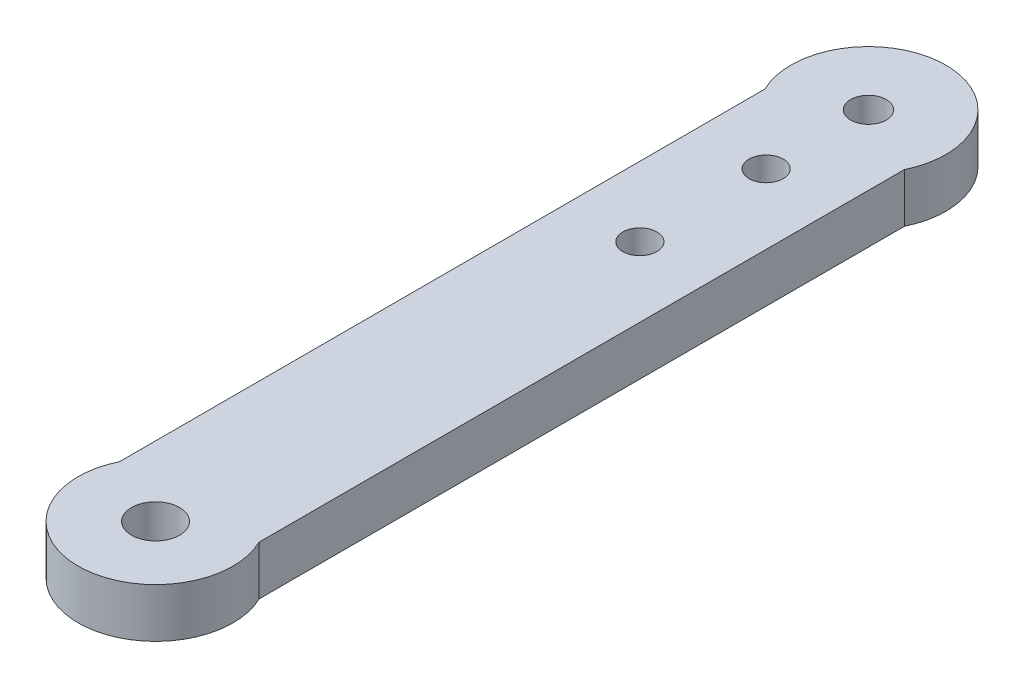
ISO-10303-21;
HEADER;
FILE_DESCRIPTION(('STEP AP214'),'2;1');
FILE_NAME('part.step','',(''),(''),'','','');
FILE_SCHEMA(('AUTOMOTIVE_DESIGN { 1 0 10303 214 1 1 1 1 }'));
ENDSEC;
DATA;
#1=APPLICATION_CONTEXT('core data for automotive mechanical design processes');
#2=APPLICATION_PROTOCOL_DEFINITION('international standard','automotive_design',2000,#1);
#3=PRODUCT_CONTEXT('',#1,'mechanical');
#4=PRODUCT('Part','Part','',(#3));
#5=PRODUCT_RELATED_PRODUCT_CATEGORY('part','',(#4));
#6=PRODUCT_DEFINITION_FORMATION('','',#4);
#7=PRODUCT_DEFINITION_CONTEXT('part definition',#1,'design');
#8=PRODUCT_DEFINITION('design','',#6,#7);
#9=PRODUCT_DEFINITION_SHAPE('','',#8);
#10=(LENGTH_UNIT() NAMED_UNIT(*) SI_UNIT(.MILLI.,.METRE.));
#11=(NAMED_UNIT(*) PLANE_ANGLE_UNIT() SI_UNIT($,.RADIAN.));
#12=(NAMED_UNIT(*) SI_UNIT($,.STERADIAN.) SOLID_ANGLE_UNIT());
#13=UNCERTAINTY_MEASURE_WITH_UNIT(LENGTH_MEASURE(1.E-05),#10,'distance_accuracy_value','');
#14=(GEOMETRIC_REPRESENTATION_CONTEXT(3) GLOBAL_UNCERTAINTY_ASSIGNED_CONTEXT((#13)) GLOBAL_UNIT_ASSIGNED_CONTEXT((#10,
#11,#12)) REPRESENTATION_CONTEXT('',''));
#15=CARTESIAN_POINT('',(0.,0.,0.));
#16=DIRECTION('',(0.,0.,1.));
#17=DIRECTION('',(1.,0.,0.));
#18=AXIS2_PLACEMENT_3D('',#15,#16,#17);
#19=CARTESIAN_POINT('',(0.,3.175,46.));
#20=DIRECTION('',(0.,1.,0.));
#21=DIRECTION('',(0.,0.,1.));
#22=AXIS2_PLACEMENT_3D('',#19,#20,#21);
#23=PLANE('',#22);
#24=CARTESIAN_POINT('',(0.,3.175,6.6));
#25=DIRECTION('',(0.,1.,0.));
#26=DIRECTION('',(0.,0.,1.));
#27=AXIS2_PLACEMENT_3D('',#24,#25,#26);
#28=CIRCLE('',#27,1.1);
#29=CARTESIAN_POINT('',(0.,3.175,7.7));
#30=VERTEX_POINT('',#29);
#31=EDGE_CURVE('E121',#30,#30,#28,.T.);
#32=ORIENTED_EDGE('',*,*,#31,.F.);
#33=EDGE_LOOP('',(#32));
#34=FACE_BOUND('',#33,.T.);
#35=CARTESIAN_POINT('',(0.,3.175,0.));
#36=DIRECTION('',(0.,1.,0.));
#37=DIRECTION('',(0.,0.,1.));
#38=AXIS2_PLACEMENT_3D('',#35,#36,#37);
#39=CIRCLE('',#38,1.15);
#40=CARTESIAN_POINT('',(0.,3.175,1.15));
#41=VERTEX_POINT('',#40);
#42=EDGE_CURVE('E100',#41,#41,#39,.T.);
#43=ORIENTED_EDGE('',*,*,#42,.F.);
#44=EDGE_LOOP('',(#43));
#45=FACE_BOUND('',#44,.T.);
#46=CARTESIAN_POINT('',(0.,3.175,46.));
#47=DIRECTION('',(0.,1.,0.));
#48=DIRECTION('',(0.,0.,1.));
#49=AXIS2_PLACEMENT_3D('',#46,#47,#48);
#50=CIRCLE('',#49,5.);
#51=CARTESIAN_POINT('',(-4.5,3.175,43.8205505282297));
#52=VERTEX_POINT('',#51);
#53=CARTESIAN_POINT('',(4.5,3.175,43.8205505282297));
#54=VERTEX_POINT('',#53);
#55=EDGE_CURVE('E85',#52,#54,#50,.T.);
#56=ORIENTED_EDGE('',*,*,#55,.T.);
#57=DIRECTION('',(0.,0.,-1.));
#58=VECTOR('',#57,1.);
#59=CARTESIAN_POINT('',(4.5,3.175,43.8205505282297));
#60=LINE('',#59,#58);
#61=CARTESIAN_POINT('',(4.5,3.175,2.17944947177034));
#62=VERTEX_POINT('',#61);
#63=EDGE_CURVE('E80',#54,#62,#60,.T.);
#64=ORIENTED_EDGE('',*,*,#63,.T.);
#65=CARTESIAN_POINT('',(0.,3.175,0.));
#66=DIRECTION('',(0.,1.,0.));
#67=DIRECTION('',(0.,0.,1.));
#68=AXIS2_PLACEMENT_3D('',#65,#66,#67);
#69=CIRCLE('',#68,5.);
#70=CARTESIAN_POINT('',(-4.5,3.175,2.17944947177034));
#71=VERTEX_POINT('',#70);
#72=EDGE_CURVE('E83',#62,#71,#69,.T.);
#73=ORIENTED_EDGE('',*,*,#72,.T.);
#74=DIRECTION('',(0.,0.,1.));
#75=VECTOR('',#74,1.);
#76=CARTESIAN_POINT('',(-4.5,3.175,43.8205505282297));
#77=LINE('',#76,#75);
#78=EDGE_CURVE('E50',#71,#52,#77,.T.);
#79=ORIENTED_EDGE('',*,*,#78,.T.);
#80=EDGE_LOOP('',(#56,#64,#73,#79));
#81=FACE_BOUND('',#80,.T.);
#82=CARTESIAN_POINT('',(0.,3.175,46.));
#83=DIRECTION('',(0.,1.,0.));
#84=DIRECTION('',(0.,0.,1.));
#85=AXIS2_PLACEMENT_3D('',#82,#83,#84);
#86=CIRCLE('',#85,1.55);
#87=CARTESIAN_POINT('',(0.,3.175,47.55));
#88=VERTEX_POINT('',#87);
#89=EDGE_CURVE('E115',#88,#88,#86,.T.);
#90=ORIENTED_EDGE('',*,*,#89,.F.);
#91=EDGE_LOOP('',(#90));
#92=FACE_BOUND('',#91,.T.);
#93=CARTESIAN_POINT('',(0.,3.175,14.75));
#94=DIRECTION('',(0.,1.,0.));
#95=DIRECTION('',(0.,0.,1.));
#96=AXIS2_PLACEMENT_3D('',#93,#94,#95);
#97=CIRCLE('',#96,1.1);
#98=CARTESIAN_POINT('',(0.,3.175,15.85));
#99=VERTEX_POINT('',#98);
#100=EDGE_CURVE('E127',#99,#99,#97,.T.);
#101=ORIENTED_EDGE('',*,*,#100,.F.);
#102=EDGE_LOOP('',(#101));
#103=FACE_BOUND('',#102,.T.);
#104=ADVANCED_FACE('F33',(#34,#45,#81,#92,#103),#23,.T.);
#105=CARTESIAN_POINT('',(0.,0.,46.));
#106=DIRECTION('',(0.,1.,0.));
#107=DIRECTION('',(0.,0.,1.));
#108=AXIS2_PLACEMENT_3D('',#105,#106,#107);
#109=PLANE('',#108);
#110=CARTESIAN_POINT('',(0.,0.,46.));
#111=DIRECTION('',(0.,1.,0.));
#112=DIRECTION('',(0.,0.,1.));
#113=AXIS2_PLACEMENT_3D('',#110,#111,#112);
#114=CIRCLE('',#113,5.);
#115=CARTESIAN_POINT('',(-4.5,0.,43.8205505282297));
#116=VERTEX_POINT('',#115);
#117=CARTESIAN_POINT('',(4.5,0.,43.8205505282297));
#118=VERTEX_POINT('',#117);
#119=EDGE_CURVE('E97',#116,#118,#114,.T.);
#120=ORIENTED_EDGE('',*,*,#119,.F.);
#121=DIRECTION('',(0.,0.,1.));
#122=VECTOR('',#121,1.);
#123=CARTESIAN_POINT('',(-4.5,0.,43.8205505282297));
#124=LINE('',#123,#122);
#125=CARTESIAN_POINT('',(-4.5,0.,2.17944947177034));
#126=VERTEX_POINT('',#125);
#127=EDGE_CURVE('E73',#126,#116,#124,.T.);
#128=ORIENTED_EDGE('',*,*,#127,.F.);
#129=CARTESIAN_POINT('',(0.,0.,0.));
#130=DIRECTION('',(0.,1.,0.));
#131=DIRECTION('',(0.,0.,1.));
#132=AXIS2_PLACEMENT_3D('',#129,#130,#131);
#133=CIRCLE('',#132,5.);
#134=CARTESIAN_POINT('',(4.5,0.,2.17944947177034));
#135=VERTEX_POINT('',#134);
#136=EDGE_CURVE('E67',#135,#126,#133,.T.);
#137=ORIENTED_EDGE('',*,*,#136,.F.);
#138=DIRECTION('',(0.,0.,-1.));
#139=VECTOR('',#138,1.);
#140=CARTESIAN_POINT('',(4.5,0.,43.8205505282297));
#141=LINE('',#140,#139);
#142=EDGE_CURVE('E89',#118,#135,#141,.T.);
#143=ORIENTED_EDGE('',*,*,#142,.F.);
#144=EDGE_LOOP('',(#120,#128,#137,#143));
#145=FACE_BOUND('',#144,.T.);
#146=CARTESIAN_POINT('',(0.,0.,0.));
#147=DIRECTION('',(0.,1.,0.));
#148=DIRECTION('',(0.,0.,1.));
#149=AXIS2_PLACEMENT_3D('',#146,#147,#148);
#150=CIRCLE('',#149,1.15);
#151=CARTESIAN_POINT('',(0.,0.,1.15));
#152=VERTEX_POINT('',#151);
#153=EDGE_CURVE('E112',#152,#152,#150,.T.);
#154=ORIENTED_EDGE('',*,*,#153,.T.);
#155=EDGE_LOOP('',(#154));
#156=FACE_BOUND('',#155,.T.);
#157=CARTESIAN_POINT('',(0.,0.,46.));
#158=DIRECTION('',(0.,1.,0.));
#159=DIRECTION('',(0.,0.,1.));
#160=AXIS2_PLACEMENT_3D('',#157,#158,#159);
#161=CIRCLE('',#160,1.55);
#162=CARTESIAN_POINT('',(0.,0.,47.55));
#163=VERTEX_POINT('',#162);
#164=EDGE_CURVE('E118',#163,#163,#161,.T.);
#165=ORIENTED_EDGE('',*,*,#164,.T.);
#166=EDGE_LOOP('',(#165));
#167=FACE_BOUND('',#166,.T.);
#168=CARTESIAN_POINT('',(0.,0.,6.6));
#169=DIRECTION('',(0.,1.,0.));
#170=DIRECTION('',(0.,0.,1.));
#171=AXIS2_PLACEMENT_3D('',#168,#169,#170);
#172=CIRCLE('',#171,1.1);
#173=CARTESIAN_POINT('',(0.,0.,7.7));
#174=VERTEX_POINT('',#173);
#175=EDGE_CURVE('E124',#174,#174,#172,.T.);
#176=ORIENTED_EDGE('',*,*,#175,.T.);
#177=EDGE_LOOP('',(#176));
#178=FACE_BOUND('',#177,.T.);
#179=CARTESIAN_POINT('',(0.,0.,14.75));
#180=DIRECTION('',(0.,1.,0.));
#181=DIRECTION('',(0.,0.,1.));
#182=AXIS2_PLACEMENT_3D('',#179,#180,#181);
#183=CIRCLE('',#182,1.1);
#184=CARTESIAN_POINT('',(0.,0.,15.85));
#185=VERTEX_POINT('',#184);
#186=EDGE_CURVE('E130',#185,#185,#183,.T.);
#187=ORIENTED_EDGE('',*,*,#186,.T.);
#188=EDGE_LOOP('',(#187));
#189=FACE_BOUND('',#188,.T.);
#190=ADVANCED_FACE('F108',(#145,#156,#167,#178,#189),#109,.F.);
#191=CARTESIAN_POINT('',(0.,3.175,46.));
#192=DIRECTION('',(0.,-1.,0.));
#193=DIRECTION('',(0.,0.,-1.));
#194=AXIS2_PLACEMENT_3D('',#191,#192,#193);
#195=CYLINDRICAL_SURFACE('',#194,5.);
#196=ORIENTED_EDGE('',*,*,#119,.T.);
#197=DIRECTION('',(0.,-1.,0.));
#198=VECTOR('',#197,1.);
#199=CARTESIAN_POINT('',(4.5,3.175,43.8205505282297));
#200=LINE('',#199,#198);
#201=EDGE_CURVE('E11',#54,#118,#200,.T.);
#202=ORIENTED_EDGE('',*,*,#201,.F.);
#203=ORIENTED_EDGE('',*,*,#55,.F.);
#204=DIRECTION('',(0.,-1.,0.));
#205=VECTOR('',#204,1.);
#206=CARTESIAN_POINT('',(-4.5,3.175,43.8205505282297));
#207=LINE('',#206,#205);
#208=EDGE_CURVE('E93',#52,#116,#207,.T.);
#209=ORIENTED_EDGE('',*,*,#208,.T.);
#210=EDGE_LOOP('',(#196,#202,#203,#209));
#211=FACE_BOUND('',#210,.T.);
#212=ADVANCED_FACE('F35',(#211),#195,.T.);
#213=CARTESIAN_POINT('',(4.5,3.175,43.8205505282297));
#214=DIRECTION('',(-1.,0.,0.));
#215=DIRECTION('',(0.,0.,1.));
#216=AXIS2_PLACEMENT_3D('',#213,#214,#215);
#217=PLANE('',#216);
#218=ORIENTED_EDGE('',*,*,#142,.T.);
#219=DIRECTION('',(0.,-1.,0.));
#220=VECTOR('',#219,1.);
#221=CARTESIAN_POINT('',(4.5,3.175,2.17944947177034));
#222=LINE('',#221,#220);
#223=EDGE_CURVE('E42',#62,#135,#222,.T.);
#224=ORIENTED_EDGE('',*,*,#223,.F.);
#225=ORIENTED_EDGE('',*,*,#63,.F.);
#226=ORIENTED_EDGE('',*,*,#201,.T.);
#227=EDGE_LOOP('',(#218,#224,#225,#226));
#228=FACE_BOUND('',#227,.T.);
#229=ADVANCED_FACE('F88',(#228),#217,.F.);
#230=CARTESIAN_POINT('',(0.,3.175,0.));
#231=DIRECTION('',(0.,-1.,0.));
#232=DIRECTION('',(0.,0.,-1.));
#233=AXIS2_PLACEMENT_3D('',#230,#231,#232);
#234=CYLINDRICAL_SURFACE('',#233,5.);
#235=ORIENTED_EDGE('',*,*,#136,.T.);
#236=DIRECTION('',(0.,-1.,0.));
#237=VECTOR('',#236,1.);
#238=CARTESIAN_POINT('',(-4.5,3.175,2.17944947177034));
#239=LINE('',#238,#237);
#240=EDGE_CURVE('E90',#71,#126,#239,.T.);
#241=ORIENTED_EDGE('',*,*,#240,.F.);
#242=ORIENTED_EDGE('',*,*,#72,.F.);
#243=ORIENTED_EDGE('',*,*,#223,.T.);
#244=EDGE_LOOP('',(#235,#241,#242,#243));
#245=FACE_BOUND('',#244,.T.);
#246=ADVANCED_FACE('F91',(#245),#234,.T.);
#247=CARTESIAN_POINT('',(-4.5,3.175,43.8205505282297));
#248=DIRECTION('',(1.,0.,0.));
#249=DIRECTION('',(0.,0.,-1.));
#250=AXIS2_PLACEMENT_3D('',#247,#248,#249);
#251=PLANE('',#250);
#252=ORIENTED_EDGE('',*,*,#127,.T.);
#253=ORIENTED_EDGE('',*,*,#208,.F.);
#254=ORIENTED_EDGE('',*,*,#78,.F.);
#255=ORIENTED_EDGE('',*,*,#240,.T.);
#256=EDGE_LOOP('',(#252,#253,#254,#255));
#257=FACE_BOUND('',#256,.T.);
#258=ADVANCED_FACE('F105',(#257),#251,.F.);
#259=CARTESIAN_POINT('',(0.,3.175,0.));
#260=DIRECTION('',(0.,-1.,0.));
#261=DIRECTION('',(0.,0.,-1.));
#262=AXIS2_PLACEMENT_3D('',#259,#260,#261);
#263=CYLINDRICAL_SURFACE('',#262,1.15);
#264=ORIENTED_EDGE('',*,*,#42,.T.);
#265=EDGE_LOOP('',(#264));
#266=FACE_BOUND('',#265,.T.);
#267=ORIENTED_EDGE('',*,*,#153,.F.);
#268=EDGE_LOOP('',(#267));
#269=FACE_BOUND('',#268,.T.);
#270=ADVANCED_FACE('F149',(#266,#269),#263,.F.);
#271=CARTESIAN_POINT('',(0.,3.175,46.));
#272=DIRECTION('',(0.,-1.,0.));
#273=DIRECTION('',(0.,0.,-1.));
#274=AXIS2_PLACEMENT_3D('',#271,#272,#273);
#275=CYLINDRICAL_SURFACE('',#274,1.55);
#276=ORIENTED_EDGE('',*,*,#89,.T.);
#277=EDGE_LOOP('',(#276));
#278=FACE_BOUND('',#277,.T.);
#279=ORIENTED_EDGE('',*,*,#164,.F.);
#280=EDGE_LOOP('',(#279));
#281=FACE_BOUND('',#280,.T.);
#282=ADVANCED_FACE('F195',(#278,#281),#275,.F.);
#283=CARTESIAN_POINT('',(0.,3.175,6.6));
#284=DIRECTION('',(0.,-1.,0.));
#285=DIRECTION('',(0.,0.,-1.));
#286=AXIS2_PLACEMENT_3D('',#283,#284,#285);
#287=CYLINDRICAL_SURFACE('',#286,1.1);
#288=ORIENTED_EDGE('',*,*,#31,.T.);
#289=EDGE_LOOP('',(#288));
#290=FACE_BOUND('',#289,.T.);
#291=ORIENTED_EDGE('',*,*,#175,.F.);
#292=EDGE_LOOP('',(#291));
#293=FACE_BOUND('',#292,.T.);
#294=ADVANCED_FACE('F203',(#290,#293),#287,.F.);
#295=CARTESIAN_POINT('',(0.,3.175,14.75));
#296=DIRECTION('',(0.,-1.,0.));
#297=DIRECTION('',(0.,0.,-1.));
#298=AXIS2_PLACEMENT_3D('',#295,#296,#297);
#299=CYLINDRICAL_SURFACE('',#298,1.1);
#300=ORIENTED_EDGE('',*,*,#100,.T.);
#301=EDGE_LOOP('',(#300));
#302=FACE_BOUND('',#301,.T.);
#303=ORIENTED_EDGE('',*,*,#186,.F.);
#304=EDGE_LOOP('',(#303));
#305=FACE_BOUND('',#304,.T.);
#306=ADVANCED_FACE('F136',(#302,#305),#299,.F.);
#307=CLOSED_SHELL('',(#104,#190,#212,#229,#246,#258,#270,#282,#294,#306));
#308=MANIFOLD_SOLID_BREP('B2',#307);
#309=ADVANCED_BREP_SHAPE_REPRESENTATION('',(#18,#308),#14);
#310=SHAPE_DEFINITION_REPRESENTATION(#9,#309);
ENDSEC;
END-ISO-10303-21;
